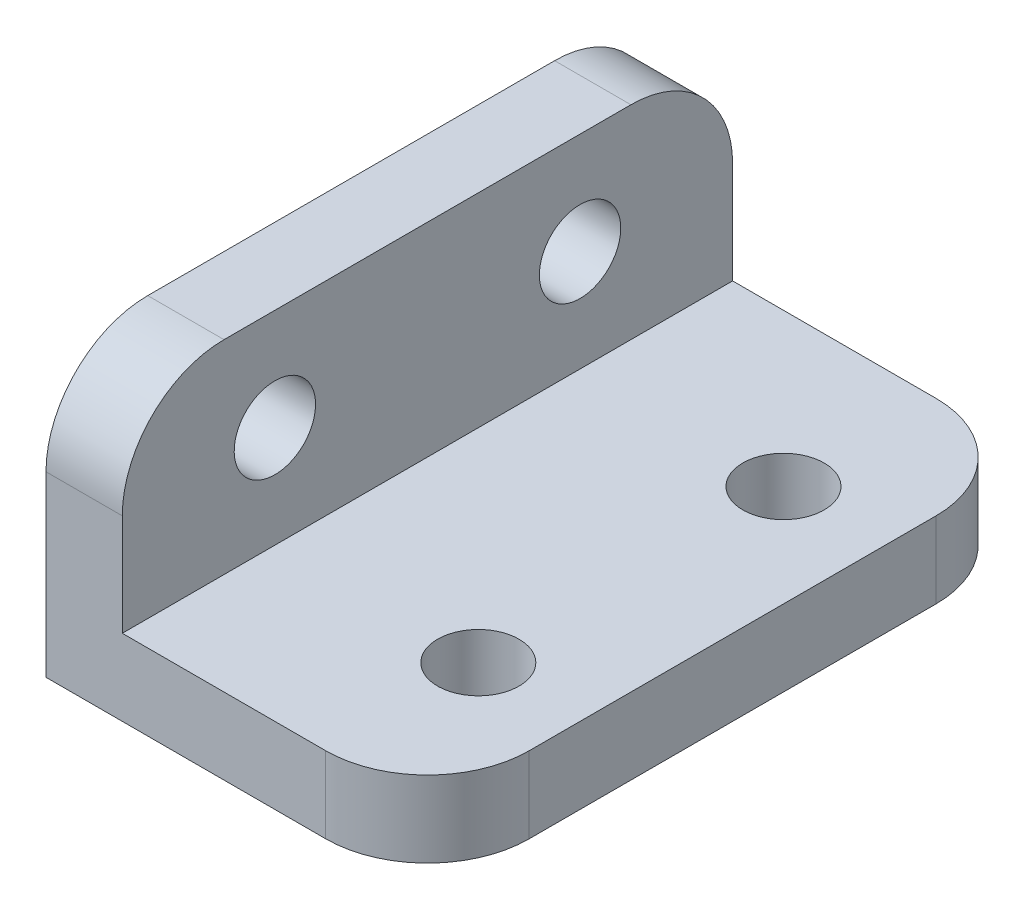
ISO-10303-21;
HEADER;
FILE_DESCRIPTION(('STEP AP214'),'2;1');
FILE_NAME('part.step','',(''),(''),'','','');
FILE_SCHEMA(('AUTOMOTIVE_DESIGN { 1 0 10303 214 1 1 1 1 }'));
ENDSEC;
DATA;
#1=APPLICATION_CONTEXT('core data for automotive mechanical design processes');
#2=APPLICATION_PROTOCOL_DEFINITION('international standard','automotive_design',2000,#1);
#3=PRODUCT_CONTEXT('',#1,'mechanical');
#4=PRODUCT('Part','Part','',(#3));
#5=PRODUCT_RELATED_PRODUCT_CATEGORY('part','',(#4));
#6=PRODUCT_DEFINITION_FORMATION('','',#4);
#7=PRODUCT_DEFINITION_CONTEXT('part definition',#1,'design');
#8=PRODUCT_DEFINITION('design','',#6,#7);
#9=PRODUCT_DEFINITION_SHAPE('','',#8);
#10=(LENGTH_UNIT() NAMED_UNIT(*) SI_UNIT(.MILLI.,.METRE.));
#11=(NAMED_UNIT(*) PLANE_ANGLE_UNIT() SI_UNIT($,.RADIAN.));
#12=(NAMED_UNIT(*) SI_UNIT($,.STERADIAN.) SOLID_ANGLE_UNIT());
#13=UNCERTAINTY_MEASURE_WITH_UNIT(LENGTH_MEASURE(1.E-05),#10,'distance_accuracy_value','');
#14=(GEOMETRIC_REPRESENTATION_CONTEXT(3) GLOBAL_UNCERTAINTY_ASSIGNED_CONTEXT((#13)) GLOBAL_UNIT_ASSIGNED_CONTEXT((#10,
#11,#12)) REPRESENTATION_CONTEXT('',''));
#15=CARTESIAN_POINT('',(0.,0.,0.));
#16=DIRECTION('',(0.,0.,1.));
#17=DIRECTION('',(1.,0.,0.));
#18=AXIS2_PLACEMENT_3D('',#15,#16,#17);
#19=CARTESIAN_POINT('',(9.40836507358763E-13,101.691622654979,-24.));
#20=DIRECTION('',(0.,-1.,0.));
#21=DIRECTION('',(1.,0.,0.));
#22=AXIS2_PLACEMENT_3D('',#19,#20,#21);
#23=PLANE('',#22);
#24=CARTESIAN_POINT('',(14.,101.691622654979,-6.));
#25=DIRECTION('',(0.,-1.,0.));
#26=DIRECTION('',(1.,0.,0.));
#27=AXIS2_PLACEMENT_3D('',#24,#25,#26);
#28=CIRCLE('',#27,1.60000000001785);
#29=CARTESIAN_POINT('',(15.6000000000178,101.691622654979,-6.));
#30=VERTEX_POINT('',#29);
#31=EDGE_CURVE('E370',#30,#30,#28,.T.);
#32=ORIENTED_EDGE('',*,*,#31,.F.);
#33=EDGE_LOOP('',(#32));
#34=FACE_BOUND('',#33,.T.);
#35=CARTESIAN_POINT('',(14.,101.691622654979,-18.));
#36=DIRECTION('',(0.,-1.,0.));
#37=DIRECTION('',(1.,0.,0.));
#38=AXIS2_PLACEMENT_3D('',#35,#36,#37);
#39=CIRCLE('',#38,1.60000000001785);
#40=CARTESIAN_POINT('',(15.6000000000178,101.691622654979,-18.));
#41=VERTEX_POINT('',#40);
#42=EDGE_CURVE('E375',#41,#41,#39,.T.);
#43=ORIENTED_EDGE('',*,*,#42,.F.);
#44=EDGE_LOOP('',(#43));
#45=FACE_BOUND('',#44,.T.);
#46=DIRECTION('',(1.,0.,0.));
#47=VECTOR('',#46,1.);
#48=CARTESIAN_POINT('',(9.40836507358763E-13,101.691622654979,-24.));
#49=LINE('',#48,#47);
#50=CARTESIAN_POINT('',(3.0000000000001,101.691622654979,-24.));
#51=VERTEX_POINT('',#50);
#52=CARTESIAN_POINT('',(14.,101.691622654979,-24.));
#53=VERTEX_POINT('',#52);
#54=EDGE_CURVE('E141',#51,#53,#49,.T.);
#55=ORIENTED_EDGE('',*,*,#54,.T.);
#56=CARTESIAN_POINT('',(14.,101.691622654979,-20.));
#57=DIRECTION('',(0.,-1.,0.));
#58=DIRECTION('',(1.,0.,0.));
#59=AXIS2_PLACEMENT_3D('',#56,#57,#58);
#60=CIRCLE('',#59,4.);
#61=CARTESIAN_POINT('',(18.,101.691622654979,-20.));
#62=VERTEX_POINT('',#61);
#63=EDGE_CURVE('E182',#53,#62,#60,.T.);
#64=ORIENTED_EDGE('',*,*,#63,.T.);
#65=DIRECTION('',(0.,0.,1.));
#66=VECTOR('',#65,1.);
#67=CARTESIAN_POINT('',(18.,101.691622654979,-24.));
#68=LINE('',#67,#66);
#69=CARTESIAN_POINT('',(18.,101.691622654979,-4.));
#70=VERTEX_POINT('',#69);
#71=EDGE_CURVE('E149',#62,#70,#68,.T.);
#72=ORIENTED_EDGE('',*,*,#71,.T.);
#73=CARTESIAN_POINT('',(14.,101.691622654979,-4.));
#74=DIRECTION('',(0.,-1.,0.));
#75=DIRECTION('',(1.,0.,0.));
#76=AXIS2_PLACEMENT_3D('',#73,#74,#75);
#77=CIRCLE('',#76,4.);
#78=CARTESIAN_POINT('',(14.,101.691622654979,0.));
#79=VERTEX_POINT('',#78);
#80=EDGE_CURVE('E180',#70,#79,#77,.T.);
#81=ORIENTED_EDGE('',*,*,#80,.T.);
#82=DIRECTION('',(1.,0.,0.));
#83=VECTOR('',#82,1.);
#84=CARTESIAN_POINT('',(9.40836507358763E-13,101.691622654979,0.));
#85=LINE('',#84,#83);
#86=CARTESIAN_POINT('',(3.0000000000001,101.691622654979,0.));
#87=VERTEX_POINT('',#86);
#88=EDGE_CURVE('E150',#87,#79,#85,.T.);
#89=ORIENTED_EDGE('',*,*,#88,.F.);
#90=DIRECTION('',(0.,0.,1.));
#91=VECTOR('',#90,1.);
#92=CARTESIAN_POINT('',(3.0000000000001,101.691622654979,-24.));
#93=LINE('',#92,#91);
#94=EDGE_CURVE('E158',#51,#87,#93,.T.);
#95=ORIENTED_EDGE('',*,*,#94,.F.);
#96=EDGE_LOOP('',(#55,#64,#72,#81,#89,#95));
#97=FACE_BOUND('',#96,.T.);
#98=ADVANCED_FACE('F37',(#34,#45,#97),#23,.T.);
#99=CARTESIAN_POINT('',(3.00000000000058,0.,-24.));
#100=DIRECTION('',(-1.,0.,0.));
#101=DIRECTION('',(0.,-1.,0.));
#102=AXIS2_PLACEMENT_3D('',#99,#100,#101);
#103=PLANE('',#102);
#104=CARTESIAN_POINT('',(3.00000000000007,108.691622654979,-6.));
#105=DIRECTION('',(-1.,0.,0.));
#106=DIRECTION('',(0.,-1.,0.));
#107=AXIS2_PLACEMENT_3D('',#104,#105,#106);
#108=CIRCLE('',#107,1.60000000000001);
#109=CARTESIAN_POINT('',(3.00000000000008,107.091622654979,-6.));
#110=VERTEX_POINT('',#109);
#111=EDGE_CURVE('E154',#110,#110,#108,.T.);
#112=ORIENTED_EDGE('',*,*,#111,.F.);
#113=EDGE_LOOP('',(#112));
#114=FACE_BOUND('',#113,.T.);
#115=CARTESIAN_POINT('',(3.00000000000007,108.691622654979,-18.));
#116=DIRECTION('',(-1.,0.,0.));
#117=DIRECTION('',(0.,-1.,0.));
#118=AXIS2_PLACEMENT_3D('',#115,#116,#117);
#119=CIRCLE('',#118,1.60000000000001);
#120=CARTESIAN_POINT('',(3.00000000000008,107.091622654979,-18.));
#121=VERTEX_POINT('',#120);
#122=EDGE_CURVE('E372',#121,#121,#119,.T.);
#123=ORIENTED_EDGE('',*,*,#122,.F.);
#124=EDGE_LOOP('',(#123));
#125=FACE_BOUND('',#124,.T.);
#126=DIRECTION('',(0.,0.,1.));
#127=VECTOR('',#126,1.);
#128=CARTESIAN_POINT('',(3.00000000000005,112.691622654979,-24.));
#129=LINE('',#128,#127);
#130=CARTESIAN_POINT('',(3.00000000000005,112.691622654979,-20.));
#131=VERTEX_POINT('',#130);
#132=CARTESIAN_POINT('',(3.00000000000005,112.691622654979,-4.));
#133=VERTEX_POINT('',#132);
#134=EDGE_CURVE('E162',#131,#133,#129,.T.);
#135=ORIENTED_EDGE('',*,*,#134,.F.);
#136=CARTESIAN_POINT('',(3.00000000000007,108.691622654979,-20.));
#137=DIRECTION('',(-1.,0.,0.));
#138=DIRECTION('',(0.,-1.,0.));
#139=AXIS2_PLACEMENT_3D('',#136,#137,#138);
#140=CIRCLE('',#139,4.);
#141=CARTESIAN_POINT('',(3.00000000000007,108.691622654979,-24.));
#142=VERTEX_POINT('',#141);
#143=EDGE_CURVE('E11',#131,#142,#140,.T.);
#144=ORIENTED_EDGE('',*,*,#143,.T.);
#145=DIRECTION('',(0.,-1.,0.));
#146=VECTOR('',#145,1.);
#147=CARTESIAN_POINT('',(3.00000000000058,0.,-24.));
#148=LINE('',#147,#146);
#149=EDGE_CURVE('E125',#142,#51,#148,.T.);
#150=ORIENTED_EDGE('',*,*,#149,.T.);
#151=ORIENTED_EDGE('',*,*,#94,.T.);
#152=DIRECTION('',(0.,-1.,0.));
#153=VECTOR('',#152,1.);
#154=CARTESIAN_POINT('',(3.00000000000058,0.,0.));
#155=LINE('',#154,#153);
#156=CARTESIAN_POINT('',(3.00000000000007,108.691622654979,0.));
#157=VERTEX_POINT('',#156);
#158=EDGE_CURVE('E144',#157,#87,#155,.T.);
#159=ORIENTED_EDGE('',*,*,#158,.F.);
#160=CARTESIAN_POINT('',(3.00000000000007,108.691622654979,-4.));
#161=DIRECTION('',(-1.,0.,0.));
#162=DIRECTION('',(0.,-1.,0.));
#163=AXIS2_PLACEMENT_3D('',#160,#161,#162);
#164=CIRCLE('',#163,4.);
#165=EDGE_CURVE('E45',#157,#133,#164,.T.);
#166=ORIENTED_EDGE('',*,*,#165,.T.);
#167=EDGE_LOOP('',(#135,#144,#150,#151,#159,#166));
#168=FACE_BOUND('',#167,.T.);
#169=ADVANCED_FACE('F202',(#114,#125,#168),#103,.T.);
#170=CARTESIAN_POINT('',(0.,112.691622654979,-24.));
#171=DIRECTION('',(0.,-1.,0.));
#172=DIRECTION('',(0.,0.,-1.));
#173=AXIS2_PLACEMENT_3D('',#170,#171,#172);
#174=PLANE('',#173);
#175=DIRECTION('',(0.,0.,1.));
#176=VECTOR('',#175,1.);
#177=CARTESIAN_POINT('',(6.00000000000005,112.691622654979,-24.));
#178=LINE('',#177,#176);
#179=CARTESIAN_POINT('',(6.00000000000005,112.691622654979,-20.));
#180=VERTEX_POINT('',#179);
#181=CARTESIAN_POINT('',(6.00000000000005,112.691622654979,-4.));
#182=VERTEX_POINT('',#181);
#183=EDGE_CURVE('E135',#180,#182,#178,.T.);
#184=ORIENTED_EDGE('',*,*,#183,.F.);
#185=DIRECTION('',(1.,0.,0.));
#186=VECTOR('',#185,1.);
#187=CARTESIAN_POINT('',(0.,112.691622654979,-20.));
#188=LINE('',#187,#186);
#189=EDGE_CURVE('E58',#180,#131,#188,.F.);
#190=ORIENTED_EDGE('',*,*,#189,.T.);
#191=ORIENTED_EDGE('',*,*,#134,.T.);
#192=DIRECTION('',(1.,0.,0.));
#193=VECTOR('',#192,1.);
#194=CARTESIAN_POINT('',(6.00000000000005,112.691622654979,-4.));
#195=LINE('',#194,#193);
#196=EDGE_CURVE('E193',#133,#182,#195,.T.);
#197=ORIENTED_EDGE('',*,*,#196,.T.);
#198=EDGE_LOOP('',(#184,#190,#191,#197));
#199=FACE_BOUND('',#198,.T.);
#200=ADVANCED_FACE('F197',(#199),#174,.F.);
#201=CARTESIAN_POINT('',(6.00000000000006,0.,-24.));
#202=DIRECTION('',(-1.,0.,0.));
#203=DIRECTION('',(0.,-1.,0.));
#204=AXIS2_PLACEMENT_3D('',#201,#202,#203);
#205=PLANE('',#204);
#206=CARTESIAN_POINT('',(6.00000000000005,108.691622654979,-6.));
#207=DIRECTION('',(1.,0.,0.));
#208=DIRECTION('',(0.,1.,0.));
#209=AXIS2_PLACEMENT_3D('',#206,#207,#208);
#210=CIRCLE('',#209,1.60000000000001);
#211=CARTESIAN_POINT('',(6.00000000000005,110.291622654979,-6.));
#212=VERTEX_POINT('',#211);
#213=EDGE_CURVE('E365',#212,#212,#210,.T.);
#214=ORIENTED_EDGE('',*,*,#213,.F.);
#215=EDGE_LOOP('',(#214));
#216=FACE_BOUND('',#215,.T.);
#217=CARTESIAN_POINT('',(6.00000000000005,108.691622654979,-18.));
#218=DIRECTION('',(1.,0.,0.));
#219=DIRECTION('',(0.,1.,0.));
#220=AXIS2_PLACEMENT_3D('',#217,#218,#219);
#221=CIRCLE('',#220,1.60000000000001);
#222=CARTESIAN_POINT('',(6.00000000000005,110.291622654979,-18.));
#223=VERTEX_POINT('',#222);
#224=EDGE_CURVE('E368',#223,#223,#221,.T.);
#225=ORIENTED_EDGE('',*,*,#224,.F.);
#226=EDGE_LOOP('',(#225));
#227=FACE_BOUND('',#226,.T.);
#228=DIRECTION('',(0.,-1.,0.));
#229=VECTOR('',#228,1.);
#230=CARTESIAN_POINT('',(6.00000000000006,0.,-24.));
#231=LINE('',#230,#229);
#232=CARTESIAN_POINT('',(6.00000000000005,108.691622654979,-24.));
#233=VERTEX_POINT('',#232);
#234=CARTESIAN_POINT('',(6.00000000000005,104.691622654979,-24.));
#235=VERTEX_POINT('',#234);
#236=EDGE_CURVE('E115',#233,#235,#231,.T.);
#237=ORIENTED_EDGE('',*,*,#236,.F.);
#238=CARTESIAN_POINT('',(6.00000000000005,108.691622654979,-20.));
#239=DIRECTION('',(-1.,0.,0.));
#240=DIRECTION('',(0.,-1.,0.));
#241=AXIS2_PLACEMENT_3D('',#238,#239,#240);
#242=CIRCLE('',#241,4.);
#243=EDGE_CURVE('E191',#233,#180,#242,.F.);
#244=ORIENTED_EDGE('',*,*,#243,.T.);
#245=ORIENTED_EDGE('',*,*,#183,.T.);
#246=CARTESIAN_POINT('',(6.00000000000005,108.691622654979,-4.));
#247=DIRECTION('',(-1.,0.,0.));
#248=DIRECTION('',(0.,-1.,0.));
#249=AXIS2_PLACEMENT_3D('',#246,#247,#248);
#250=CIRCLE('',#249,4.);
#251=CARTESIAN_POINT('',(6.00000000000005,108.691622654979,0.));
#252=VERTEX_POINT('',#251);
#253=EDGE_CURVE('E189',#182,#252,#250,.F.);
#254=ORIENTED_EDGE('',*,*,#253,.T.);
#255=DIRECTION('',(0.,-1.,0.));
#256=VECTOR('',#255,1.);
#257=CARTESIAN_POINT('',(6.00000000000006,0.,0.));
#258=LINE('',#257,#256);
#259=CARTESIAN_POINT('',(6.00000000000005,104.691622654979,0.));
#260=VERTEX_POINT('',#259);
#261=EDGE_CURVE('E131',#252,#260,#258,.T.);
#262=ORIENTED_EDGE('',*,*,#261,.T.);
#263=DIRECTION('',(0.,0.,1.));
#264=VECTOR('',#263,1.);
#265=CARTESIAN_POINT('',(6.00000000000005,104.691622654979,-24.));
#266=LINE('',#265,#264);
#267=EDGE_CURVE('E128',#235,#260,#266,.T.);
#268=ORIENTED_EDGE('',*,*,#267,.F.);
#269=EDGE_LOOP('',(#237,#244,#245,#254,#262,#268));
#270=FACE_BOUND('',#269,.T.);
#271=ADVANCED_FACE('F129',(#216,#227,#270),#205,.F.);
#272=CARTESIAN_POINT('',(0.,104.691622654979,-24.));
#273=DIRECTION('',(0.,-1.,0.));
#274=DIRECTION('',(0.,0.,-1.));
#275=AXIS2_PLACEMENT_3D('',#272,#273,#274);
#276=PLANE('',#275);
#277=CARTESIAN_POINT('',(14.,104.691622654979,-6.));
#278=DIRECTION('',(0.,1.,0.));
#279=DIRECTION('',(-1.,0.,0.));
#280=AXIS2_PLACEMENT_3D('',#277,#278,#279);
#281=CIRCLE('',#280,1.60000000001785);
#282=CARTESIAN_POINT('',(12.3999999999821,104.691622654979,-6.));
#283=VERTEX_POINT('',#282);
#284=EDGE_CURVE('E387',#283,#283,#281,.T.);
#285=ORIENTED_EDGE('',*,*,#284,.F.);
#286=EDGE_LOOP('',(#285));
#287=FACE_BOUND('',#286,.T.);
#288=CARTESIAN_POINT('',(14.,104.691622654979,-18.));
#289=DIRECTION('',(0.,1.,0.));
#290=DIRECTION('',(-1.,0.,0.));
#291=AXIS2_PLACEMENT_3D('',#288,#289,#290);
#292=CIRCLE('',#291,1.60000000001785);
#293=CARTESIAN_POINT('',(12.3999999999821,104.691622654979,-18.));
#294=VERTEX_POINT('',#293);
#295=EDGE_CURVE('E388',#294,#294,#292,.T.);
#296=ORIENTED_EDGE('',*,*,#295,.F.);
#297=EDGE_LOOP('',(#296));
#298=FACE_BOUND('',#297,.T.);
#299=DIRECTION('',(0.,0.,1.));
#300=VECTOR('',#299,1.);
#301=CARTESIAN_POINT('',(18.,104.691622654979,-24.));
#302=LINE('',#301,#300);
#303=CARTESIAN_POINT('',(18.,104.691622654979,-20.));
#304=VERTEX_POINT('',#303);
#305=CARTESIAN_POINT('',(18.,104.691622654979,-4.));
#306=VERTEX_POINT('',#305);
#307=EDGE_CURVE('E136',#304,#306,#302,.T.);
#308=ORIENTED_EDGE('',*,*,#307,.F.);
#309=CARTESIAN_POINT('',(14.,104.691622654979,-20.));
#310=DIRECTION('',(0.,-1.,0.));
#311=DIRECTION('',(0.,0.,-1.));
#312=AXIS2_PLACEMENT_3D('',#309,#310,#311);
#313=CIRCLE('',#312,4.);
#314=CARTESIAN_POINT('',(14.,104.691622654979,-24.));
#315=VERTEX_POINT('',#314);
#316=EDGE_CURVE('E140',#304,#315,#313,.F.);
#317=ORIENTED_EDGE('',*,*,#316,.T.);
#318=DIRECTION('',(1.,0.,0.));
#319=VECTOR('',#318,1.);
#320=CARTESIAN_POINT('',(0.,104.691622654979,-24.));
#321=LINE('',#320,#319);
#322=EDGE_CURVE('E119',#235,#315,#321,.T.);
#323=ORIENTED_EDGE('',*,*,#322,.F.);
#324=ORIENTED_EDGE('',*,*,#267,.T.);
#325=DIRECTION('',(1.,0.,0.));
#326=VECTOR('',#325,1.);
#327=CARTESIAN_POINT('',(0.,104.691622654979,0.));
#328=LINE('',#327,#326);
#329=CARTESIAN_POINT('',(14.,104.691622654979,0.));
#330=VERTEX_POINT('',#329);
#331=EDGE_CURVE('E153',#260,#330,#328,.T.);
#332=ORIENTED_EDGE('',*,*,#331,.T.);
#333=CARTESIAN_POINT('',(14.,104.691622654979,-4.));
#334=DIRECTION('',(0.,-1.,0.));
#335=DIRECTION('',(0.,0.,-1.));
#336=AXIS2_PLACEMENT_3D('',#333,#334,#335);
#337=CIRCLE('',#336,4.);
#338=EDGE_CURVE('E174',#330,#306,#337,.F.);
#339=ORIENTED_EDGE('',*,*,#338,.T.);
#340=EDGE_LOOP('',(#308,#317,#323,#324,#332,#339));
#341=FACE_BOUND('',#340,.T.);
#342=ADVANCED_FACE('F139',(#287,#298,#341),#276,.F.);
#343=CARTESIAN_POINT('',(18.,0.,-24.));
#344=DIRECTION('',(1.,0.,0.));
#345=DIRECTION('',(0.,0.,-1.));
#346=AXIS2_PLACEMENT_3D('',#343,#344,#345);
#347=PLANE('',#346);
#348=ORIENTED_EDGE('',*,*,#71,.F.);
#349=DIRECTION('',(0.,1.,0.));
#350=VECTOR('',#349,1.);
#351=CARTESIAN_POINT('',(18.,104.691622654979,-20.));
#352=LINE('',#351,#350);
#353=EDGE_CURVE('E171',#62,#304,#352,.T.);
#354=ORIENTED_EDGE('',*,*,#353,.T.);
#355=ORIENTED_EDGE('',*,*,#307,.T.);
#356=DIRECTION('',(0.,1.,0.));
#357=VECTOR('',#356,1.);
#358=CARTESIAN_POINT('',(18.,0.,-4.));
#359=LINE('',#358,#357);
#360=EDGE_CURVE('E161',#306,#70,#359,.F.);
#361=ORIENTED_EDGE('',*,*,#360,.T.);
#362=EDGE_LOOP('',(#348,#354,#355,#361));
#363=FACE_BOUND('',#362,.T.);
#364=ADVANCED_FACE('F213',(#363),#347,.T.);
#365=CARTESIAN_POINT('',(0.,0.,-24.));
#366=DIRECTION('',(0.,0.,1.));
#367=DIRECTION('',(1.,0.,0.));
#368=AXIS2_PLACEMENT_3D('',#365,#366,#367);
#369=PLANE('',#368);
#370=ORIENTED_EDGE('',*,*,#322,.T.);
#371=DIRECTION('',(0.,1.,0.));
#372=VECTOR('',#371,1.);
#373=CARTESIAN_POINT('',(14.,101.691622654979,-24.));
#374=LINE('',#373,#372);
#375=EDGE_CURVE('E178',#315,#53,#374,.F.);
#376=ORIENTED_EDGE('',*,*,#375,.T.);
#377=ORIENTED_EDGE('',*,*,#54,.F.);
#378=ORIENTED_EDGE('',*,*,#149,.F.);
#379=DIRECTION('',(1.,0.,0.));
#380=VECTOR('',#379,1.);
#381=CARTESIAN_POINT('',(0.,108.691622654979,-24.));
#382=LINE('',#381,#380);
#383=EDGE_CURVE('E123',#142,#233,#382,.T.);
#384=ORIENTED_EDGE('',*,*,#383,.T.);
#385=ORIENTED_EDGE('',*,*,#236,.T.);
#386=EDGE_LOOP('',(#370,#376,#377,#378,#384,#385));
#387=FACE_BOUND('',#386,.T.);
#388=ADVANCED_FACE('F117',(#387),#369,.F.);
#389=CARTESIAN_POINT('',(0.,0.,0.));
#390=DIRECTION('',(0.,0.,1.));
#391=DIRECTION('',(1.,0.,0.));
#392=AXIS2_PLACEMENT_3D('',#389,#390,#391);
#393=PLANE('',#392);
#394=ORIENTED_EDGE('',*,*,#88,.T.);
#395=DIRECTION('',(0.,1.,0.));
#396=VECTOR('',#395,1.);
#397=CARTESIAN_POINT('',(14.,0.,0.));
#398=LINE('',#397,#396);
#399=EDGE_CURVE('E186',#79,#330,#398,.T.);
#400=ORIENTED_EDGE('',*,*,#399,.T.);
#401=ORIENTED_EDGE('',*,*,#331,.F.);
#402=ORIENTED_EDGE('',*,*,#261,.F.);
#403=DIRECTION('',(1.,0.,0.));
#404=VECTOR('',#403,1.);
#405=CARTESIAN_POINT('',(3.00000000000005,108.691622654979,0.));
#406=LINE('',#405,#404);
#407=EDGE_CURVE('E184',#252,#157,#406,.F.);
#408=ORIENTED_EDGE('',*,*,#407,.T.);
#409=ORIENTED_EDGE('',*,*,#158,.T.);
#410=EDGE_LOOP('',(#394,#400,#401,#402,#408,#409));
#411=FACE_BOUND('',#410,.T.);
#412=ADVANCED_FACE('F220',(#411),#393,.T.);
#413=CARTESIAN_POINT('',(-18.,108.691622654979,-18.));
#414=DIRECTION('',(1.,0.,0.));
#415=DIRECTION('',(0.,1.,0.));
#416=AXIS2_PLACEMENT_3D('',#413,#414,#415);
#417=CYLINDRICAL_SURFACE('',#416,1.60000000000001);
#418=ORIENTED_EDGE('',*,*,#122,.T.);
#419=EDGE_LOOP('',(#418));
#420=FACE_BOUND('',#419,.T.);
#421=ORIENTED_EDGE('',*,*,#224,.T.);
#422=EDGE_LOOP('',(#421));
#423=FACE_BOUND('',#422,.T.);
#424=ADVANCED_FACE('F290',(#420,#423),#417,.F.);
#425=CARTESIAN_POINT('',(-18.,108.691622654979,-6.));
#426=DIRECTION('',(1.,0.,0.));
#427=DIRECTION('',(0.,1.,0.));
#428=AXIS2_PLACEMENT_3D('',#425,#426,#427);
#429=CYLINDRICAL_SURFACE('',#428,1.60000000000001);
#430=ORIENTED_EDGE('',*,*,#111,.T.);
#431=EDGE_LOOP('',(#430));
#432=FACE_BOUND('',#431,.T.);
#433=ORIENTED_EDGE('',*,*,#213,.T.);
#434=EDGE_LOOP('',(#433));
#435=FACE_BOUND('',#434,.T.);
#436=ADVANCED_FACE('F281',(#432,#435),#429,.F.);
#437=CARTESIAN_POINT('',(14.,80.6916226549791,-18.));
#438=DIRECTION('',(0.,1.,0.));
#439=DIRECTION('',(-1.,0.,0.));
#440=AXIS2_PLACEMENT_3D('',#437,#438,#439);
#441=CYLINDRICAL_SURFACE('',#440,1.60000000001785);
#442=ORIENTED_EDGE('',*,*,#42,.T.);
#443=EDGE_LOOP('',(#442));
#444=FACE_BOUND('',#443,.T.);
#445=ORIENTED_EDGE('',*,*,#295,.T.);
#446=EDGE_LOOP('',(#445));
#447=FACE_BOUND('',#446,.T.);
#448=ADVANCED_FACE('F272',(#444,#447),#441,.F.);
#449=CARTESIAN_POINT('',(14.,80.6916226549791,-6.));
#450=DIRECTION('',(0.,1.,0.));
#451=DIRECTION('',(-1.,0.,0.));
#452=AXIS2_PLACEMENT_3D('',#449,#450,#451);
#453=CYLINDRICAL_SURFACE('',#452,1.60000000001785);
#454=ORIENTED_EDGE('',*,*,#31,.T.);
#455=EDGE_LOOP('',(#454));
#456=FACE_BOUND('',#455,.T.);
#457=ORIENTED_EDGE('',*,*,#284,.T.);
#458=EDGE_LOOP('',(#457));
#459=FACE_BOUND('',#458,.T.);
#460=ADVANCED_FACE('F241',(#456,#459),#453,.F.);
#461=CARTESIAN_POINT('',(14.,0.,-20.));
#462=DIRECTION('',(0.,-1.,0.));
#463=DIRECTION('',(0.,0.,-1.));
#464=AXIS2_PLACEMENT_3D('',#461,#462,#463);
#465=CYLINDRICAL_SURFACE('',#464,4.);
#466=ORIENTED_EDGE('',*,*,#63,.F.);
#467=ORIENTED_EDGE('',*,*,#375,.F.);
#468=ORIENTED_EDGE('',*,*,#316,.F.);
#469=ORIENTED_EDGE('',*,*,#353,.F.);
#470=EDGE_LOOP('',(#466,#467,#468,#469));
#471=FACE_BOUND('',#470,.T.);
#472=ADVANCED_FACE('F211',(#471),#465,.T.);
#473=CARTESIAN_POINT('',(14.,0.,-4.));
#474=DIRECTION('',(0.,1.,0.));
#475=DIRECTION('',(0.,0.,1.));
#476=AXIS2_PLACEMENT_3D('',#473,#474,#475);
#477=CYLINDRICAL_SURFACE('',#476,4.);
#478=ORIENTED_EDGE('',*,*,#80,.F.);
#479=ORIENTED_EDGE('',*,*,#360,.F.);
#480=ORIENTED_EDGE('',*,*,#338,.F.);
#481=ORIENTED_EDGE('',*,*,#399,.F.);
#482=EDGE_LOOP('',(#478,#479,#480,#481));
#483=FACE_BOUND('',#482,.T.);
#484=ADVANCED_FACE('F218',(#483),#477,.T.);
#485=CARTESIAN_POINT('',(0.,108.691622654979,-20.));
#486=DIRECTION('',(1.,0.,0.));
#487=DIRECTION('',(0.,0.,-1.));
#488=AXIS2_PLACEMENT_3D('',#485,#486,#487);
#489=CYLINDRICAL_SURFACE('',#488,4.);
#490=ORIENTED_EDGE('',*,*,#143,.F.);
#491=ORIENTED_EDGE('',*,*,#189,.F.);
#492=ORIENTED_EDGE('',*,*,#243,.F.);
#493=ORIENTED_EDGE('',*,*,#383,.F.);
#494=EDGE_LOOP('',(#490,#491,#492,#493));
#495=FACE_BOUND('',#494,.T.);
#496=ADVANCED_FACE('F201',(#495),#489,.T.);
#497=CARTESIAN_POINT('',(0.,108.691622654979,-4.));
#498=DIRECTION('',(-1.,0.,0.));
#499=DIRECTION('',(0.,0.,1.));
#500=AXIS2_PLACEMENT_3D('',#497,#498,#499);
#501=CYLINDRICAL_SURFACE('',#500,4.);
#502=ORIENTED_EDGE('',*,*,#165,.F.);
#503=ORIENTED_EDGE('',*,*,#407,.F.);
#504=ORIENTED_EDGE('',*,*,#253,.F.);
#505=ORIENTED_EDGE('',*,*,#196,.F.);
#506=EDGE_LOOP('',(#502,#503,#504,#505));
#507=FACE_BOUND('',#506,.T.);
#508=ADVANCED_FACE('F39',(#507),#501,.T.);
#509=CLOSED_SHELL('',(#98,#169,#200,#271,#342,#364,#388,#412,#424,#436,#448,#460,#472,#484,#496,#508));
#510=MANIFOLD_SOLID_BREP('B2',#509);
#511=ADVANCED_BREP_SHAPE_REPRESENTATION('',(#18,#510),#14);
#512=SHAPE_DEFINITION_REPRESENTATION(#9,#511);
ENDSEC;
END-ISO-10303-21;
